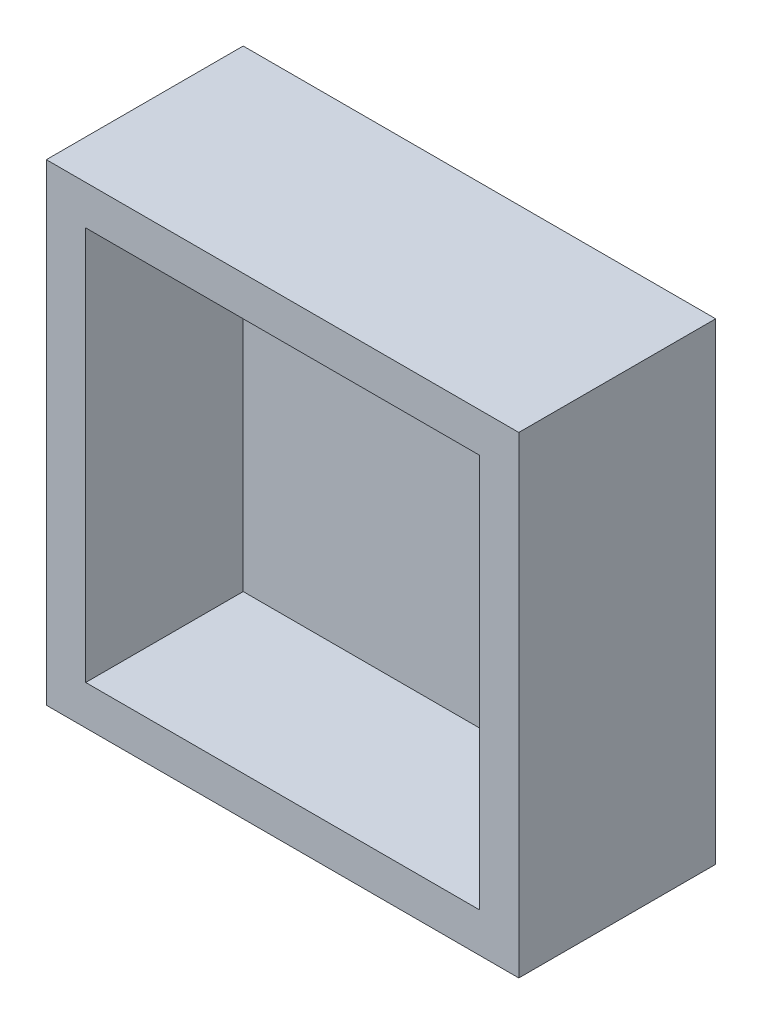
ISO-10303-21;
HEADER;
FILE_DESCRIPTION(('STEP AP214'),'2;1');
FILE_NAME('part.step','',(''),(''),'','','');
FILE_SCHEMA(('AUTOMOTIVE_DESIGN { 1 0 10303 214 1 1 1 1 }'));
ENDSEC;
DATA;
#1=APPLICATION_CONTEXT('core data for automotive mechanical design processes');
#2=APPLICATION_PROTOCOL_DEFINITION('international standard','automotive_design',2000,#1);
#3=PRODUCT_CONTEXT('',#1,'mechanical');
#4=PRODUCT('Part','Part','',(#3));
#5=PRODUCT_RELATED_PRODUCT_CATEGORY('part','',(#4));
#6=PRODUCT_DEFINITION_FORMATION('','',#4);
#7=PRODUCT_DEFINITION_CONTEXT('part definition',#1,'design');
#8=PRODUCT_DEFINITION('design','',#6,#7);
#9=PRODUCT_DEFINITION_SHAPE('','',#8);
#10=(LENGTH_UNIT() NAMED_UNIT(*) SI_UNIT(.MILLI.,.METRE.));
#11=(NAMED_UNIT(*) PLANE_ANGLE_UNIT() SI_UNIT($,.RADIAN.));
#12=(NAMED_UNIT(*) SI_UNIT($,.STERADIAN.) SOLID_ANGLE_UNIT());
#13=UNCERTAINTY_MEASURE_WITH_UNIT(LENGTH_MEASURE(1.E-05),#10,'distance_accuracy_value','');
#14=(GEOMETRIC_REPRESENTATION_CONTEXT(3) GLOBAL_UNCERTAINTY_ASSIGNED_CONTEXT((#13)) GLOBAL_UNIT_ASSIGNED_CONTEXT((#10,
#11,#12)) REPRESENTATION_CONTEXT('',''));
#15=CARTESIAN_POINT('',(0.,0.,0.));
#16=DIRECTION('',(0.,0.,1.));
#17=DIRECTION('',(1.,0.,0.));
#18=AXIS2_PLACEMENT_3D('',#15,#16,#17);
#19=CARTESIAN_POINT('',(0.,0.,2.));
#20=DIRECTION('',(0.,0.,1.));
#21=DIRECTION('',(1.,0.,0.));
#22=AXIS2_PLACEMENT_3D('',#19,#20,#21);
#23=PLANE('',#22);
#24=DIRECTION('',(0.,1.,0.));
#25=VECTOR('',#24,1.);
#26=CARTESIAN_POINT('',(9.99999999999999,10.,2.));
#27=LINE('',#26,#25);
#28=CARTESIAN_POINT('',(10.,-10.,2.));
#29=VERTEX_POINT('',#28);
#30=CARTESIAN_POINT('',(9.99999999999999,10.,2.));
#31=VERTEX_POINT('',#30);
#32=EDGE_CURVE('E163',#29,#31,#27,.T.);
#33=ORIENTED_EDGE('',*,*,#32,.T.);
#34=DIRECTION('',(-1.,0.,0.));
#35=VECTOR('',#34,1.);
#36=CARTESIAN_POINT('',(-10.,10.,2.));
#37=LINE('',#36,#35);
#38=CARTESIAN_POINT('',(-10.,10.,2.));
#39=VERTEX_POINT('',#38);
#40=EDGE_CURVE('E171',#31,#39,#37,.T.);
#41=ORIENTED_EDGE('',*,*,#40,.T.);
#42=DIRECTION('',(0.,-1.,0.));
#43=VECTOR('',#42,1.);
#44=CARTESIAN_POINT('',(-10.,10.,2.));
#45=LINE('',#44,#43);
#46=CARTESIAN_POINT('',(-10.,-10.,2.));
#47=VERTEX_POINT('',#46);
#48=EDGE_CURVE('E53',#39,#47,#45,.T.);
#49=ORIENTED_EDGE('',*,*,#48,.T.);
#50=DIRECTION('',(1.,0.,0.));
#51=VECTOR('',#50,1.);
#52=CARTESIAN_POINT('',(-10.,-10.,2.));
#53=LINE('',#52,#51);
#54=EDGE_CURVE('E11',#47,#29,#53,.T.);
#55=ORIENTED_EDGE('',*,*,#54,.T.);
#56=EDGE_LOOP('',(#33,#41,#49,#55));
#57=FACE_BOUND('',#56,.T.);
#58=ADVANCED_FACE('F45',(#57),#23,.T.);
#59=CARTESIAN_POINT('',(0.,0.,0.));
#60=DIRECTION('',(0.,0.,1.));
#61=DIRECTION('',(1.,0.,0.));
#62=AXIS2_PLACEMENT_3D('',#59,#60,#61);
#63=PLANE('',#62);
#64=DIRECTION('',(-1.,0.,0.));
#65=VECTOR('',#64,1.);
#66=CARTESIAN_POINT('',(9.99999999999999,12.,0.));
#67=LINE('',#66,#65);
#68=CARTESIAN_POINT('',(12.,12.,0.));
#69=VERTEX_POINT('',#68);
#70=CARTESIAN_POINT('',(-12.,12.,0.));
#71=VERTEX_POINT('',#70);
#72=EDGE_CURVE('E152',#69,#71,#67,.T.);
#73=ORIENTED_EDGE('',*,*,#72,.F.);
#74=DIRECTION('',(0.,1.,0.));
#75=VECTOR('',#74,1.);
#76=CARTESIAN_POINT('',(12.,12.,0.));
#77=LINE('',#76,#75);
#78=CARTESIAN_POINT('',(12.,-12.,0.));
#79=VERTEX_POINT('',#78);
#80=EDGE_CURVE('E114',#79,#69,#77,.T.);
#81=ORIENTED_EDGE('',*,*,#80,.F.);
#82=DIRECTION('',(1.,0.,0.));
#83=VECTOR('',#82,1.);
#84=CARTESIAN_POINT('',(-10.,-12.,0.));
#85=LINE('',#84,#83);
#86=CARTESIAN_POINT('',(-12.,-12.,0.));
#87=VERTEX_POINT('',#86);
#88=EDGE_CURVE('E109',#87,#79,#85,.T.);
#89=ORIENTED_EDGE('',*,*,#88,.F.);
#90=DIRECTION('',(0.,-1.,0.));
#91=VECTOR('',#90,1.);
#92=CARTESIAN_POINT('',(-12.,-12.,0.));
#93=LINE('',#92,#91);
#94=EDGE_CURVE('E112',#71,#87,#93,.T.);
#95=ORIENTED_EDGE('',*,*,#94,.F.);
#96=EDGE_LOOP('',(#73,#81,#89,#95));
#97=FACE_BOUND('',#96,.T.);
#98=ADVANCED_FACE('F47',(#97),#63,.F.);
#99=CARTESIAN_POINT('',(10.,-12.,10.));
#100=DIRECTION('',(0.,0.,-1.));
#101=DIRECTION('',(-1.,0.,0.));
#102=AXIS2_PLACEMENT_3D('',#99,#100,#101);
#103=PLANE('',#102);
#104=DIRECTION('',(-1.,0.,0.));
#105=VECTOR('',#104,1.);
#106=CARTESIAN_POINT('',(10.,-10.,10.));
#107=LINE('',#106,#105);
#108=CARTESIAN_POINT('',(10.,-10.,10.));
#109=VERTEX_POINT('',#108);
#110=CARTESIAN_POINT('',(-10.,-10.,10.));
#111=VERTEX_POINT('',#110);
#112=EDGE_CURVE('E165',#109,#111,#107,.T.);
#113=ORIENTED_EDGE('',*,*,#112,.T.);
#114=DIRECTION('',(0.,1.,0.));
#115=VECTOR('',#114,1.);
#116=CARTESIAN_POINT('',(-10.,12.,10.));
#117=LINE('',#116,#115);
#118=CARTESIAN_POINT('',(-10.,10.,10.));
#119=VERTEX_POINT('',#118);
#120=EDGE_CURVE('E133',#111,#119,#117,.T.);
#121=ORIENTED_EDGE('',*,*,#120,.T.);
#122=DIRECTION('',(1.,0.,0.));
#123=VECTOR('',#122,1.);
#124=CARTESIAN_POINT('',(-10.,10.,10.));
#125=LINE('',#124,#123);
#126=CARTESIAN_POINT('',(10.,10.,10.));
#127=VERTEX_POINT('',#126);
#128=EDGE_CURVE('E158',#119,#127,#125,.T.);
#129=ORIENTED_EDGE('',*,*,#128,.T.);
#130=DIRECTION('',(0.,-1.,0.));
#131=VECTOR('',#130,1.);
#132=CARTESIAN_POINT('',(10.,-12.,10.));
#133=LINE('',#132,#131);
#134=EDGE_CURVE('E139',#127,#109,#133,.T.);
#135=ORIENTED_EDGE('',*,*,#134,.T.);
#136=EDGE_LOOP('',(#113,#121,#129,#135));
#137=FACE_BOUND('',#136,.T.);
#138=DIRECTION('',(0.,1.,0.));
#139=VECTOR('',#138,1.);
#140=CARTESIAN_POINT('',(-12.,12.,10.));
#141=LINE('',#140,#139);
#142=CARTESIAN_POINT('',(-12.,-12.,10.));
#143=VERTEX_POINT('',#142);
#144=CARTESIAN_POINT('',(-12.,12.,10.));
#145=VERTEX_POINT('',#144);
#146=EDGE_CURVE('E127',#143,#145,#141,.T.);
#147=ORIENTED_EDGE('',*,*,#146,.F.);
#148=DIRECTION('',(-1.,0.,0.));
#149=VECTOR('',#148,1.);
#150=CARTESIAN_POINT('',(10.,-12.,10.));
#151=LINE('',#150,#149);
#152=CARTESIAN_POINT('',(12.,-12.,10.));
#153=VERTEX_POINT('',#152);
#154=EDGE_CURVE('E118',#153,#143,#151,.T.);
#155=ORIENTED_EDGE('',*,*,#154,.F.);
#156=DIRECTION('',(0.,-1.,0.));
#157=VECTOR('',#156,1.);
#158=CARTESIAN_POINT('',(12.,-12.,10.));
#159=LINE('',#158,#157);
#160=CARTESIAN_POINT('',(12.,12.,10.));
#161=VERTEX_POINT('',#160);
#162=EDGE_CURVE('E141',#161,#153,#159,.T.);
#163=ORIENTED_EDGE('',*,*,#162,.F.);
#164=DIRECTION('',(1.,0.,0.));
#165=VECTOR('',#164,1.);
#166=CARTESIAN_POINT('',(-10.,12.,10.));
#167=LINE('',#166,#165);
#168=EDGE_CURVE('E154',#145,#161,#167,.T.);
#169=ORIENTED_EDGE('',*,*,#168,.F.);
#170=EDGE_LOOP('',(#147,#155,#163,#169));
#171=FACE_BOUND('',#170,.T.);
#172=ADVANCED_FACE('F185',(#137,#171),#103,.F.);
#173=CARTESIAN_POINT('',(0.,-12.,0.));
#174=DIRECTION('',(0.,-1.,0.));
#175=DIRECTION('',(0.,0.,-1.));
#176=AXIS2_PLACEMENT_3D('',#173,#174,#175);
#177=PLANE('',#176);
#178=ORIENTED_EDGE('',*,*,#88,.T.);
#179=DIRECTION('',(0.,0.,-1.));
#180=VECTOR('',#179,1.);
#181=CARTESIAN_POINT('',(12.,-12.,0.));
#182=LINE('',#181,#180);
#183=EDGE_CURVE('E144',#153,#79,#182,.T.);
#184=ORIENTED_EDGE('',*,*,#183,.F.);
#185=ORIENTED_EDGE('',*,*,#154,.T.);
#186=DIRECTION('',(0.,0.,1.));
#187=VECTOR('',#186,1.);
#188=CARTESIAN_POINT('',(-12.,-12.,10.));
#189=LINE('',#188,#187);
#190=EDGE_CURVE('E122',#87,#143,#189,.T.);
#191=ORIENTED_EDGE('',*,*,#190,.F.);
#192=EDGE_LOOP('',(#178,#184,#185,#191));
#193=FACE_BOUND('',#192,.T.);
#194=ADVANCED_FACE('F123',(#193),#177,.T.);
#195=CARTESIAN_POINT('',(0.,-10.,0.));
#196=DIRECTION('',(0.,-1.,0.));
#197=DIRECTION('',(0.,0.,-1.));
#198=AXIS2_PLACEMENT_3D('',#195,#196,#197);
#199=PLANE('',#198);
#200=ORIENTED_EDGE('',*,*,#54,.F.);
#201=DIRECTION('',(0.,0.,-1.));
#202=VECTOR('',#201,1.);
#203=CARTESIAN_POINT('',(-10.,-10.,0.));
#204=LINE('',#203,#202);
#205=EDGE_CURVE('E119',#111,#47,#204,.T.);
#206=ORIENTED_EDGE('',*,*,#205,.F.);
#207=ORIENTED_EDGE('',*,*,#112,.F.);
#208=DIRECTION('',(0.,0.,1.));
#209=VECTOR('',#208,1.);
#210=CARTESIAN_POINT('',(10.,-10.,0.));
#211=LINE('',#210,#209);
#212=EDGE_CURVE('E60',#29,#109,#211,.T.);
#213=ORIENTED_EDGE('',*,*,#212,.F.);
#214=EDGE_LOOP('',(#200,#206,#207,#213));
#215=FACE_BOUND('',#214,.T.);
#216=ADVANCED_FACE('F180',(#215),#199,.F.);
#217=CARTESIAN_POINT('',(0.,12.,0.));
#218=DIRECTION('',(0.,1.,0.));
#219=DIRECTION('',(0.,0.,1.));
#220=AXIS2_PLACEMENT_3D('',#217,#218,#219);
#221=PLANE('',#220);
#222=ORIENTED_EDGE('',*,*,#72,.T.);
#223=DIRECTION('',(0.,0.,-1.));
#224=VECTOR('',#223,1.);
#225=CARTESIAN_POINT('',(-12.,12.,0.));
#226=LINE('',#225,#224);
#227=EDGE_CURVE('E132',#145,#71,#226,.T.);
#228=ORIENTED_EDGE('',*,*,#227,.F.);
#229=ORIENTED_EDGE('',*,*,#168,.T.);
#230=DIRECTION('',(0.,0.,1.));
#231=VECTOR('',#230,1.);
#232=CARTESIAN_POINT('',(12.,12.,10.));
#233=LINE('',#232,#231);
#234=EDGE_CURVE('E147',#69,#161,#233,.T.);
#235=ORIENTED_EDGE('',*,*,#234,.F.);
#236=EDGE_LOOP('',(#222,#228,#229,#235));
#237=FACE_BOUND('',#236,.T.);
#238=ADVANCED_FACE('F191',(#237),#221,.T.);
#239=CARTESIAN_POINT('',(0.,10.,0.));
#240=DIRECTION('',(0.,1.,0.));
#241=DIRECTION('',(0.,0.,1.));
#242=AXIS2_PLACEMENT_3D('',#239,#240,#241);
#243=PLANE('',#242);
#244=ORIENTED_EDGE('',*,*,#40,.F.);
#245=DIRECTION('',(0.,0.,-1.));
#246=VECTOR('',#245,1.);
#247=CARTESIAN_POINT('',(10.,10.,10.));
#248=LINE('',#247,#246);
#249=EDGE_CURVE('E155',#127,#31,#248,.T.);
#250=ORIENTED_EDGE('',*,*,#249,.F.);
#251=ORIENTED_EDGE('',*,*,#128,.F.);
#252=DIRECTION('',(0.,0.,1.));
#253=VECTOR('',#252,1.);
#254=CARTESIAN_POINT('',(-10.,10.,0.));
#255=LINE('',#254,#253);
#256=EDGE_CURVE('E67',#39,#119,#255,.T.);
#257=ORIENTED_EDGE('',*,*,#256,.F.);
#258=EDGE_LOOP('',(#244,#250,#251,#257));
#259=FACE_BOUND('',#258,.T.);
#260=ADVANCED_FACE('F188',(#259),#243,.F.);
#261=CARTESIAN_POINT('',(12.,0.,0.));
#262=DIRECTION('',(-1.,0.,0.));
#263=DIRECTION('',(0.,-1.,0.));
#264=AXIS2_PLACEMENT_3D('',#261,#262,#263);
#265=PLANE('',#264);
#266=ORIENTED_EDGE('',*,*,#162,.T.);
#267=ORIENTED_EDGE('',*,*,#183,.T.);
#268=ORIENTED_EDGE('',*,*,#80,.T.);
#269=ORIENTED_EDGE('',*,*,#234,.T.);
#270=EDGE_LOOP('',(#266,#267,#268,#269));
#271=FACE_BOUND('',#270,.T.);
#272=ADVANCED_FACE('F190',(#271),#265,.F.);
#273=CARTESIAN_POINT('',(10.,0.,0.));
#274=DIRECTION('',(-1.,0.,0.));
#275=DIRECTION('',(0.,-1.,0.));
#276=AXIS2_PLACEMENT_3D('',#273,#274,#275);
#277=PLANE('',#276);
#278=ORIENTED_EDGE('',*,*,#134,.F.);
#279=ORIENTED_EDGE('',*,*,#249,.T.);
#280=ORIENTED_EDGE('',*,*,#32,.F.);
#281=ORIENTED_EDGE('',*,*,#212,.T.);
#282=EDGE_LOOP('',(#278,#279,#280,#281));
#283=FACE_BOUND('',#282,.T.);
#284=ADVANCED_FACE('F184',(#283),#277,.T.);
#285=CARTESIAN_POINT('',(-12.,0.,0.));
#286=DIRECTION('',(1.,0.,0.));
#287=DIRECTION('',(0.,1.,0.));
#288=AXIS2_PLACEMENT_3D('',#285,#286,#287);
#289=PLANE('',#288);
#290=ORIENTED_EDGE('',*,*,#94,.T.);
#291=ORIENTED_EDGE('',*,*,#190,.T.);
#292=ORIENTED_EDGE('',*,*,#146,.T.);
#293=ORIENTED_EDGE('',*,*,#227,.T.);
#294=EDGE_LOOP('',(#290,#291,#292,#293));
#295=FACE_BOUND('',#294,.T.);
#296=ADVANCED_FACE('F130',(#295),#289,.F.);
#297=CARTESIAN_POINT('',(-10.,0.,0.));
#298=DIRECTION('',(1.,0.,0.));
#299=DIRECTION('',(0.,1.,0.));
#300=AXIS2_PLACEMENT_3D('',#297,#298,#299);
#301=PLANE('',#300);
#302=ORIENTED_EDGE('',*,*,#120,.F.);
#303=ORIENTED_EDGE('',*,*,#205,.T.);
#304=ORIENTED_EDGE('',*,*,#48,.F.);
#305=ORIENTED_EDGE('',*,*,#256,.T.);
#306=EDGE_LOOP('',(#302,#303,#304,#305));
#307=FACE_BOUND('',#306,.T.);
#308=ADVANCED_FACE('F179',(#307),#301,.T.);
#309=CLOSED_SHELL('',(#58,#98,#172,#194,#216,#238,#260,#272,#284,#296,#308));
#310=MANIFOLD_SOLID_BREP('B2',#309);
#311=ADVANCED_BREP_SHAPE_REPRESENTATION('',(#18,#310),#14);
#312=SHAPE_DEFINITION_REPRESENTATION(#9,#311);
ENDSEC;
END-ISO-10303-21;
